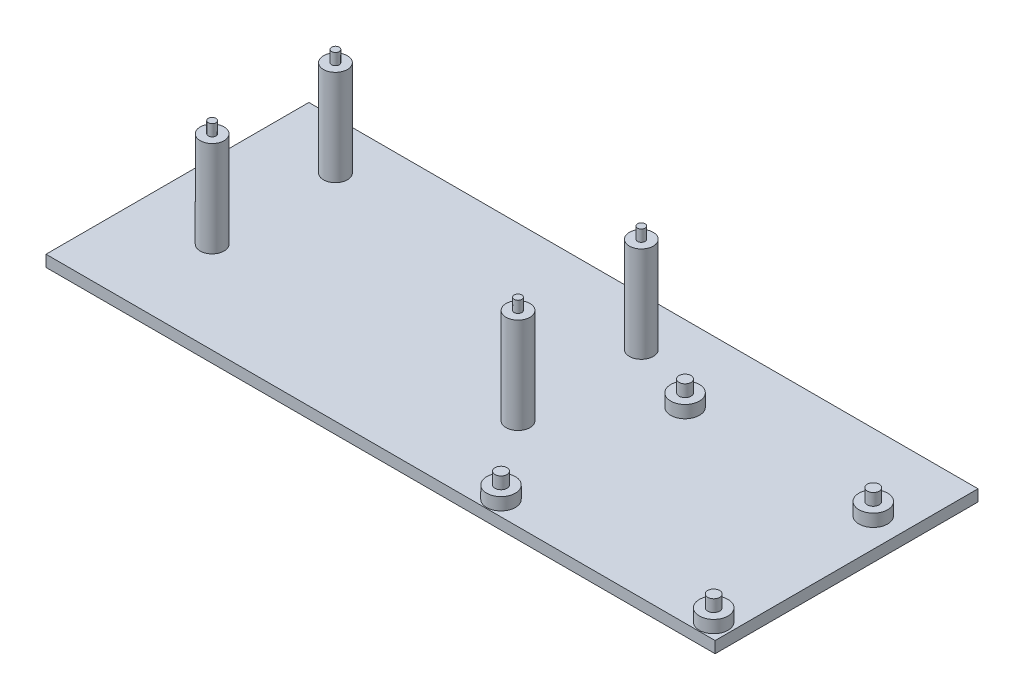
ISO-10303-21;
HEADER;
FILE_DESCRIPTION(('STEP AP214'),'2;1');
FILE_NAME('part.step','',(''),(''),'','','');
FILE_SCHEMA(('AUTOMOTIVE_DESIGN { 1 0 10303 214 1 1 1 1 }'));
ENDSEC;
DATA;
#1=APPLICATION_CONTEXT('core data for automotive mechanical design processes');
#2=APPLICATION_PROTOCOL_DEFINITION('international standard','automotive_design',2000,#1);
#3=PRODUCT_CONTEXT('',#1,'mechanical');
#4=PRODUCT('Part','Part','',(#3));
#5=PRODUCT_RELATED_PRODUCT_CATEGORY('part','',(#4));
#6=PRODUCT_DEFINITION_FORMATION('','',#4);
#7=PRODUCT_DEFINITION_CONTEXT('part definition',#1,'design');
#8=PRODUCT_DEFINITION('design','',#6,#7);
#9=PRODUCT_DEFINITION_SHAPE('','',#8);
#10=(LENGTH_UNIT() NAMED_UNIT(*) SI_UNIT(.MILLI.,.METRE.));
#11=(NAMED_UNIT(*) PLANE_ANGLE_UNIT() SI_UNIT($,.RADIAN.));
#12=(NAMED_UNIT(*) SI_UNIT($,.STERADIAN.) SOLID_ANGLE_UNIT());
#13=UNCERTAINTY_MEASURE_WITH_UNIT(LENGTH_MEASURE(1.E-05),#10,'distance_accuracy_value','');
#14=(GEOMETRIC_REPRESENTATION_CONTEXT(3) GLOBAL_UNCERTAINTY_ASSIGNED_CONTEXT((#13)) GLOBAL_UNIT_ASSIGNED_CONTEXT((#10,
#11,#12)) REPRESENTATION_CONTEXT('',''));
#15=CARTESIAN_POINT('',(0.,0.,0.));
#16=DIRECTION('',(0.,0.,1.));
#17=DIRECTION('',(1.,0.,0.));
#18=AXIS2_PLACEMENT_3D('',#15,#16,#17);
#19=CARTESIAN_POINT('',(-70.,2.4,27.5));
#20=DIRECTION('',(-1.,0.,0.));
#21=DIRECTION('',(0.,0.,1.));
#22=AXIS2_PLACEMENT_3D('',#19,#20,#21);
#23=PLANE('',#22);
#24=DIRECTION('',(0.,0.,-1.));
#25=VECTOR('',#24,1.);
#26=CARTESIAN_POINT('',(-70.,0.,27.5));
#27=LINE('',#26,#25);
#28=CARTESIAN_POINT('',(-70.,0.,27.5));
#29=VERTEX_POINT('',#28);
#30=CARTESIAN_POINT('',(-70.,0.,-27.5));
#31=VERTEX_POINT('',#30);
#32=EDGE_CURVE('E118',#29,#31,#27,.T.);
#33=ORIENTED_EDGE('',*,*,#32,.F.);
#34=DIRECTION('',(0.,-1.,0.));
#35=VECTOR('',#34,1.);
#36=CARTESIAN_POINT('',(-70.,2.4,27.5));
#37=LINE('',#36,#35);
#38=CARTESIAN_POINT('',(-70.,2.4,27.5));
#39=VERTEX_POINT('',#38);
#40=EDGE_CURVE('E65',#39,#29,#37,.T.);
#41=ORIENTED_EDGE('',*,*,#40,.F.);
#42=DIRECTION('',(0.,0.,-1.));
#43=VECTOR('',#42,1.);
#44=CARTESIAN_POINT('',(-70.,2.4,27.5));
#45=LINE('',#44,#43);
#46=CARTESIAN_POINT('',(-70.,2.4,-27.5));
#47=VERTEX_POINT('',#46);
#48=EDGE_CURVE('E112',#39,#47,#45,.T.);
#49=ORIENTED_EDGE('',*,*,#48,.T.);
#50=DIRECTION('',(0.,-1.,0.));
#51=VECTOR('',#50,1.);
#52=CARTESIAN_POINT('',(-70.,2.4,-27.5));
#53=LINE('',#52,#51);
#54=EDGE_CURVE('E90',#47,#31,#53,.T.);
#55=ORIENTED_EDGE('',*,*,#54,.T.);
#56=EDGE_LOOP('',(#33,#41,#49,#55));
#57=FACE_BOUND('',#56,.T.);
#58=ADVANCED_FACE('F47',(#57),#23,.T.);
#59=CARTESIAN_POINT('',(-70.,2.4,27.5));
#60=DIRECTION('',(0.,0.,-1.));
#61=DIRECTION('',(-1.,0.,0.));
#62=AXIS2_PLACEMENT_3D('',#59,#60,#61);
#63=PLANE('',#62);
#64=DIRECTION('',(1.,0.,0.));
#65=VECTOR('',#64,1.);
#66=CARTESIAN_POINT('',(-70.,0.,27.5));
#67=LINE('',#66,#65);
#68=CARTESIAN_POINT('',(70.,0.,27.5));
#69=VERTEX_POINT('',#68);
#70=EDGE_CURVE('E82',#29,#69,#67,.T.);
#71=ORIENTED_EDGE('',*,*,#70,.T.);
#72=DIRECTION('',(0.,-1.,0.));
#73=VECTOR('',#72,1.);
#74=CARTESIAN_POINT('',(70.,2.4,27.5));
#75=LINE('',#74,#73);
#76=CARTESIAN_POINT('',(70.,2.4,27.5));
#77=VERTEX_POINT('',#76);
#78=EDGE_CURVE('E109',#77,#69,#75,.T.);
#79=ORIENTED_EDGE('',*,*,#78,.F.);
#80=DIRECTION('',(1.,0.,0.));
#81=VECTOR('',#80,1.);
#82=CARTESIAN_POINT('',(-70.,2.4,27.5));
#83=LINE('',#82,#81);
#84=EDGE_CURVE('E100',#39,#77,#83,.T.);
#85=ORIENTED_EDGE('',*,*,#84,.F.);
#86=ORIENTED_EDGE('',*,*,#40,.T.);
#87=EDGE_LOOP('',(#71,#79,#85,#86));
#88=FACE_BOUND('',#87,.T.);
#89=ADVANCED_FACE('F231',(#88),#63,.F.);
#90=CARTESIAN_POINT('',(70.,2.4,27.5));
#91=DIRECTION('',(-1.,0.,0.));
#92=DIRECTION('',(0.,0.,1.));
#93=AXIS2_PLACEMENT_3D('',#90,#91,#92);
#94=PLANE('',#93);
#95=DIRECTION('',(0.,0.,-1.));
#96=VECTOR('',#95,1.);
#97=CARTESIAN_POINT('',(70.,0.,27.5));
#98=LINE('',#97,#96);
#99=CARTESIAN_POINT('',(70.,0.,-27.5));
#100=VERTEX_POINT('',#99);
#101=EDGE_CURVE('E107',#69,#100,#98,.T.);
#102=ORIENTED_EDGE('',*,*,#101,.T.);
#103=DIRECTION('',(0.,-1.,0.));
#104=VECTOR('',#103,1.);
#105=CARTESIAN_POINT('',(70.,2.4,-27.5));
#106=LINE('',#105,#104);
#107=CARTESIAN_POINT('',(70.,2.4,-27.5));
#108=VERTEX_POINT('',#107);
#109=EDGE_CURVE('E104',#108,#100,#106,.T.);
#110=ORIENTED_EDGE('',*,*,#109,.F.);
#111=DIRECTION('',(0.,0.,-1.));
#112=VECTOR('',#111,1.);
#113=CARTESIAN_POINT('',(70.,2.4,27.5));
#114=LINE('',#113,#112);
#115=EDGE_CURVE('E95',#77,#108,#114,.T.);
#116=ORIENTED_EDGE('',*,*,#115,.F.);
#117=ORIENTED_EDGE('',*,*,#78,.T.);
#118=EDGE_LOOP('',(#102,#110,#116,#117));
#119=FACE_BOUND('',#118,.T.);
#120=ADVANCED_FACE('F105',(#119),#94,.F.);
#121=CARTESIAN_POINT('',(-70.,2.4,-27.5));
#122=DIRECTION('',(0.,0.,-1.));
#123=DIRECTION('',(-1.,0.,0.));
#124=AXIS2_PLACEMENT_3D('',#121,#122,#123);
#125=PLANE('',#124);
#126=DIRECTION('',(1.,0.,0.));
#127=VECTOR('',#126,1.);
#128=CARTESIAN_POINT('',(-70.,0.,-27.5));
#129=LINE('',#128,#127);
#130=EDGE_CURVE('E121',#31,#100,#129,.T.);
#131=ORIENTED_EDGE('',*,*,#130,.F.);
#132=ORIENTED_EDGE('',*,*,#54,.F.);
#133=DIRECTION('',(1.,0.,0.));
#134=VECTOR('',#133,1.);
#135=CARTESIAN_POINT('',(-70.,2.4,-27.5));
#136=LINE('',#135,#134);
#137=EDGE_CURVE('E99',#47,#108,#136,.T.);
#138=ORIENTED_EDGE('',*,*,#137,.T.);
#139=ORIENTED_EDGE('',*,*,#109,.T.);
#140=EDGE_LOOP('',(#131,#132,#138,#139));
#141=FACE_BOUND('',#140,.T.);
#142=ADVANCED_FACE('F111',(#141),#125,.T.);
#143=CARTESIAN_POINT('',(0.,2.4,0.));
#144=DIRECTION('',(0.,-1.,0.));
#145=DIRECTION('',(0.,0.,-1.));
#146=AXIS2_PLACEMENT_3D('',#143,#144,#145);
#147=PLANE('',#146);
#148=CARTESIAN_POINT('',(9.56,2.4,8.29999999999999));
#149=DIRECTION('',(0.,-1.,0.));
#150=DIRECTION('',(0.,0.,-1.));
#151=AXIS2_PLACEMENT_3D('',#148,#149,#150);
#152=CIRCLE('',#151,2.5);
#153=CARTESIAN_POINT('',(9.56,2.4,5.79999999999999));
#154=VERTEX_POINT('',#153);
#155=EDGE_CURVE('E50',#154,#154,#152,.F.);
#156=ORIENTED_EDGE('',*,*,#155,.F.);
#157=EDGE_LOOP('',(#156));
#158=FACE_BOUND('',#157,.T.);
#159=CARTESIAN_POINT('',(-54.44,2.4,8.3));
#160=DIRECTION('',(0.,-1.,0.));
#161=DIRECTION('',(0.,0.,-1.));
#162=AXIS2_PLACEMENT_3D('',#159,#160,#161);
#163=CIRCLE('',#162,2.5);
#164=CARTESIAN_POINT('',(-54.44,2.4,5.8));
#165=VERTEX_POINT('',#164);
#166=EDGE_CURVE('E148',#165,#165,#163,.F.);
#167=ORIENTED_EDGE('',*,*,#166,.F.);
#168=EDGE_LOOP('',(#167));
#169=FACE_BOUND('',#168,.T.);
#170=CARTESIAN_POINT('',(-54.44,2.4,-17.5));
#171=DIRECTION('',(0.,-1.,0.));
#172=DIRECTION('',(0.,0.,-1.));
#173=AXIS2_PLACEMENT_3D('',#170,#171,#172);
#174=CIRCLE('',#173,2.5);
#175=CARTESIAN_POINT('',(-54.44,2.4,-20.));
#176=VERTEX_POINT('',#175);
#177=EDGE_CURVE('E145',#176,#176,#174,.F.);
#178=ORIENTED_EDGE('',*,*,#177,.F.);
#179=EDGE_LOOP('',(#178));
#180=FACE_BOUND('',#179,.T.);
#181=CARTESIAN_POINT('',(9.55999999999999,2.4,-17.5));
#182=DIRECTION('',(0.,-1.,0.));
#183=DIRECTION('',(0.,0.,-1.));
#184=AXIS2_PLACEMENT_3D('',#181,#182,#183);
#185=CIRCLE('',#184,2.5);
#186=CARTESIAN_POINT('',(9.55999999999999,2.4,-20.));
#187=VERTEX_POINT('',#186);
#188=EDGE_CURVE('E142',#187,#187,#185,.F.);
#189=ORIENTED_EDGE('',*,*,#188,.F.);
#190=EDGE_LOOP('',(#189));
#191=FACE_BOUND('',#190,.T.);
#192=CARTESIAN_POINT('',(24.56,2.4,-11.65));
#193=DIRECTION('',(0.,-1.,0.));
#194=DIRECTION('',(0.,0.,-1.));
#195=AXIS2_PLACEMENT_3D('',#192,#193,#194);
#196=CIRCLE('',#195,3.);
#197=CARTESIAN_POINT('',(24.56,2.4,-14.65));
#198=VERTEX_POINT('',#197);
#199=EDGE_CURVE('E138',#198,#198,#196,.F.);
#200=ORIENTED_EDGE('',*,*,#199,.F.);
#201=EDGE_LOOP('',(#200));
#202=FACE_BOUND('',#201,.T.);
#203=CARTESIAN_POINT('',(22.,2.4,24.3));
#204=DIRECTION('',(0.,-1.,0.));
#205=DIRECTION('',(0.,0.,-1.));
#206=AXIS2_PLACEMENT_3D('',#203,#204,#205);
#207=CIRCLE('',#206,3.);
#208=CARTESIAN_POINT('',(22.,2.4,21.3));
#209=VERTEX_POINT('',#208);
#210=EDGE_CURVE('E135',#209,#209,#207,.F.);
#211=ORIENTED_EDGE('',*,*,#210,.F.);
#212=EDGE_LOOP('',(#211));
#213=FACE_BOUND('',#212,.T.);
#214=CARTESIAN_POINT('',(63.94,2.4,-11.65));
#215=DIRECTION('',(0.,-1.,0.));
#216=DIRECTION('',(0.,0.,-1.));
#217=AXIS2_PLACEMENT_3D('',#214,#215,#216);
#218=CIRCLE('',#217,3.00000000000001);
#219=CARTESIAN_POINT('',(63.94,2.4,-14.65));
#220=VERTEX_POINT('',#219);
#221=EDGE_CURVE('E132',#220,#220,#218,.F.);
#222=ORIENTED_EDGE('',*,*,#221,.F.);
#223=EDGE_LOOP('',(#222));
#224=FACE_BOUND('',#223,.T.);
#225=CARTESIAN_POINT('',(66.5,2.4,24.3));
#226=DIRECTION('',(0.,-1.,0.));
#227=DIRECTION('',(0.,0.,-1.));
#228=AXIS2_PLACEMENT_3D('',#225,#226,#227);
#229=CIRCLE('',#228,3.00000000000001);
#230=CARTESIAN_POINT('',(66.5,2.4,21.3));
#231=VERTEX_POINT('',#230);
#232=EDGE_CURVE('E127',#231,#231,#229,.F.);
#233=ORIENTED_EDGE('',*,*,#232,.F.);
#234=EDGE_LOOP('',(#233));
#235=FACE_BOUND('',#234,.T.);
#236=ORIENTED_EDGE('',*,*,#48,.F.);
#237=ORIENTED_EDGE('',*,*,#84,.T.);
#238=ORIENTED_EDGE('',*,*,#115,.T.);
#239=ORIENTED_EDGE('',*,*,#137,.F.);
#240=EDGE_LOOP('',(#236,#237,#238,#239));
#241=FACE_BOUND('',#240,.T.);
#242=ADVANCED_FACE('F98',(#158,#169,#180,#191,#202,#213,#224,#235,#241),#147,.F.);
#243=CARTESIAN_POINT('',(0.,0.,0.));
#244=DIRECTION('',(0.,-1.,0.));
#245=DIRECTION('',(0.,0.,-1.));
#246=AXIS2_PLACEMENT_3D('',#243,#244,#245);
#247=PLANE('',#246);
#248=ORIENTED_EDGE('',*,*,#32,.T.);
#249=ORIENTED_EDGE('',*,*,#130,.T.);
#250=ORIENTED_EDGE('',*,*,#101,.F.);
#251=ORIENTED_EDGE('',*,*,#70,.F.);
#252=EDGE_LOOP('',(#248,#249,#250,#251));
#253=FACE_BOUND('',#252,.T.);
#254=ADVANCED_FACE('F216',(#253),#247,.T.);
#255=CARTESIAN_POINT('',(66.5,5.,24.3));
#256=DIRECTION('',(0.,-1.,0.));
#257=DIRECTION('',(0.,0.,-1.));
#258=AXIS2_PLACEMENT_3D('',#255,#256,#257);
#259=CYLINDRICAL_SURFACE('',#258,3.00000000000001);
#260=CARTESIAN_POINT('',(66.5,5.,24.3));
#261=DIRECTION('',(0.,1.,0.));
#262=DIRECTION('',(0.,0.,1.));
#263=AXIS2_PLACEMENT_3D('',#260,#261,#262);
#264=CIRCLE('',#263,3.00000000000001);
#265=CARTESIAN_POINT('',(66.5,5.,27.3));
#266=VERTEX_POINT('',#265);
#267=EDGE_CURVE('E122',#266,#266,#264,.T.);
#268=ORIENTED_EDGE('',*,*,#267,.F.);
#269=EDGE_LOOP('',(#268));
#270=FACE_BOUND('',#269,.T.);
#271=ORIENTED_EDGE('',*,*,#232,.T.);
#272=EDGE_LOOP('',(#271));
#273=FACE_BOUND('',#272,.T.);
#274=ADVANCED_FACE('F213',(#270,#273),#259,.T.);
#275=CARTESIAN_POINT('',(66.5,5.,24.3));
#276=DIRECTION('',(0.,1.,0.));
#277=DIRECTION('',(0.,0.,1.));
#278=AXIS2_PLACEMENT_3D('',#275,#276,#277);
#279=PLANE('',#278);
#280=CARTESIAN_POINT('',(66.5,5.,24.3));
#281=DIRECTION('',(0.,1.,0.));
#282=DIRECTION('',(0.,0.,1.));
#283=AXIS2_PLACEMENT_3D('',#280,#281,#282);
#284=CIRCLE('',#283,1.25);
#285=CARTESIAN_POINT('',(66.5,5.,25.55));
#286=VERTEX_POINT('',#285);
#287=EDGE_CURVE('E184',#286,#286,#284,.T.);
#288=ORIENTED_EDGE('',*,*,#287,.F.);
#289=EDGE_LOOP('',(#288));
#290=FACE_BOUND('',#289,.T.);
#291=ORIENTED_EDGE('',*,*,#267,.T.);
#292=EDGE_LOOP('',(#291));
#293=FACE_BOUND('',#292,.T.);
#294=ADVANCED_FACE('F211',(#290,#293),#279,.T.);
#295=CARTESIAN_POINT('',(63.94,5.,-11.65));
#296=DIRECTION('',(0.,-1.,0.));
#297=DIRECTION('',(0.,0.,-1.));
#298=AXIS2_PLACEMENT_3D('',#295,#296,#297);
#299=CYLINDRICAL_SURFACE('',#298,3.00000000000001);
#300=CARTESIAN_POINT('',(63.94,5.,-11.65));
#301=DIRECTION('',(0.,1.,0.));
#302=DIRECTION('',(0.,0.,1.));
#303=AXIS2_PLACEMENT_3D('',#300,#301,#302);
#304=CIRCLE('',#303,3.00000000000001);
#305=CARTESIAN_POINT('',(63.94,5.,-8.65));
#306=VERTEX_POINT('',#305);
#307=EDGE_CURVE('E206',#306,#306,#304,.T.);
#308=ORIENTED_EDGE('',*,*,#307,.F.);
#309=EDGE_LOOP('',(#308));
#310=FACE_BOUND('',#309,.T.);
#311=ORIENTED_EDGE('',*,*,#221,.T.);
#312=EDGE_LOOP('',(#311));
#313=FACE_BOUND('',#312,.T.);
#314=ADVANCED_FACE('F266',(#310,#313),#299,.T.);
#315=CARTESIAN_POINT('',(63.94,5.,-11.65));
#316=DIRECTION('',(0.,1.,0.));
#317=DIRECTION('',(0.,0.,1.));
#318=AXIS2_PLACEMENT_3D('',#315,#316,#317);
#319=PLANE('',#318);
#320=CARTESIAN_POINT('',(63.94,5.,-11.65));
#321=DIRECTION('',(0.,1.,0.));
#322=DIRECTION('',(0.,0.,1.));
#323=AXIS2_PLACEMENT_3D('',#320,#321,#322);
#324=CIRCLE('',#323,1.25);
#325=CARTESIAN_POINT('',(63.94,5.,-10.4));
#326=VERTEX_POINT('',#325);
#327=EDGE_CURVE('E146',#326,#326,#324,.T.);
#328=ORIENTED_EDGE('',*,*,#327,.F.);
#329=EDGE_LOOP('',(#328));
#330=FACE_BOUND('',#329,.T.);
#331=ORIENTED_EDGE('',*,*,#307,.T.);
#332=EDGE_LOOP('',(#331));
#333=FACE_BOUND('',#332,.T.);
#334=ADVANCED_FACE('F271',(#330,#333),#319,.T.);
#335=CARTESIAN_POINT('',(22.,5.,24.3));
#336=DIRECTION('',(0.,-1.,0.));
#337=DIRECTION('',(0.,0.,-1.));
#338=AXIS2_PLACEMENT_3D('',#335,#336,#337);
#339=CYLINDRICAL_SURFACE('',#338,3.);
#340=CARTESIAN_POINT('',(22.,5.,24.3));
#341=DIRECTION('',(0.,1.,0.));
#342=DIRECTION('',(0.,0.,1.));
#343=AXIS2_PLACEMENT_3D('',#340,#341,#342);
#344=CIRCLE('',#343,3.);
#345=CARTESIAN_POINT('',(22.,5.,27.3));
#346=VERTEX_POINT('',#345);
#347=EDGE_CURVE('E203',#346,#346,#344,.T.);
#348=ORIENTED_EDGE('',*,*,#347,.F.);
#349=EDGE_LOOP('',(#348));
#350=FACE_BOUND('',#349,.T.);
#351=ORIENTED_EDGE('',*,*,#210,.T.);
#352=EDGE_LOOP('',(#351));
#353=FACE_BOUND('',#352,.T.);
#354=ADVANCED_FACE('F279',(#350,#353),#339,.T.);
#355=CARTESIAN_POINT('',(22.,5.,24.3));
#356=DIRECTION('',(0.,1.,0.));
#357=DIRECTION('',(0.,0.,1.));
#358=AXIS2_PLACEMENT_3D('',#355,#356,#357);
#359=PLANE('',#358);
#360=CARTESIAN_POINT('',(22.,5.,24.3));
#361=DIRECTION('',(0.,1.,0.));
#362=DIRECTION('',(0.,0.,1.));
#363=AXIS2_PLACEMENT_3D('',#360,#361,#362);
#364=CIRCLE('',#363,1.25);
#365=CARTESIAN_POINT('',(22.,5.,25.55));
#366=VERTEX_POINT('',#365);
#367=EDGE_CURVE('E141',#366,#366,#364,.T.);
#368=ORIENTED_EDGE('',*,*,#367,.F.);
#369=EDGE_LOOP('',(#368));
#370=FACE_BOUND('',#369,.T.);
#371=ORIENTED_EDGE('',*,*,#347,.T.);
#372=EDGE_LOOP('',(#371));
#373=FACE_BOUND('',#372,.T.);
#374=ADVANCED_FACE('F284',(#370,#373),#359,.T.);
#375=CARTESIAN_POINT('',(24.56,5.,-11.65));
#376=DIRECTION('',(0.,-1.,0.));
#377=DIRECTION('',(0.,0.,-1.));
#378=AXIS2_PLACEMENT_3D('',#375,#376,#377);
#379=CYLINDRICAL_SURFACE('',#378,3.);
#380=CARTESIAN_POINT('',(24.56,5.,-11.65));
#381=DIRECTION('',(0.,1.,0.));
#382=DIRECTION('',(0.,0.,1.));
#383=AXIS2_PLACEMENT_3D('',#380,#381,#382);
#384=CIRCLE('',#383,3.);
#385=CARTESIAN_POINT('',(24.56,5.,-8.65000000000001));
#386=VERTEX_POINT('',#385);
#387=EDGE_CURVE('E198',#386,#386,#384,.T.);
#388=ORIENTED_EDGE('',*,*,#387,.F.);
#389=EDGE_LOOP('',(#388));
#390=FACE_BOUND('',#389,.T.);
#391=ORIENTED_EDGE('',*,*,#199,.T.);
#392=EDGE_LOOP('',(#391));
#393=FACE_BOUND('',#392,.T.);
#394=ADVANCED_FACE('F292',(#390,#393),#379,.T.);
#395=CARTESIAN_POINT('',(24.56,5.,-11.65));
#396=DIRECTION('',(0.,1.,0.));
#397=DIRECTION('',(0.,0.,1.));
#398=AXIS2_PLACEMENT_3D('',#395,#396,#397);
#399=PLANE('',#398);
#400=CARTESIAN_POINT('',(24.56,5.,-11.65));
#401=DIRECTION('',(0.,1.,0.));
#402=DIRECTION('',(0.,0.,1.));
#403=AXIS2_PLACEMENT_3D('',#400,#401,#402);
#404=CIRCLE('',#403,1.25);
#405=CARTESIAN_POINT('',(24.56,5.,-10.4));
#406=VERTEX_POINT('',#405);
#407=EDGE_CURVE('E190',#406,#406,#404,.T.);
#408=ORIENTED_EDGE('',*,*,#407,.F.);
#409=EDGE_LOOP('',(#408));
#410=FACE_BOUND('',#409,.T.);
#411=ORIENTED_EDGE('',*,*,#387,.T.);
#412=EDGE_LOOP('',(#411));
#413=FACE_BOUND('',#412,.T.);
#414=ADVANCED_FACE('F297',(#410,#413),#399,.T.);
#415=CARTESIAN_POINT('',(22.,7.5,24.3));
#416=DIRECTION('',(0.,-1.,0.));
#417=DIRECTION('',(0.,0.,-1.));
#418=AXIS2_PLACEMENT_3D('',#415,#416,#417);
#419=CYLINDRICAL_SURFACE('',#418,1.25);
#420=CARTESIAN_POINT('',(22.,7.5,24.3));
#421=DIRECTION('',(0.,1.,0.));
#422=DIRECTION('',(0.,0.,1.));
#423=AXIS2_PLACEMENT_3D('',#420,#421,#422);
#424=CIRCLE('',#423,1.25);
#425=CARTESIAN_POINT('',(22.,7.5,25.55));
#426=VERTEX_POINT('',#425);
#427=EDGE_CURVE('E193',#426,#426,#424,.T.);
#428=ORIENTED_EDGE('',*,*,#427,.F.);
#429=EDGE_LOOP('',(#428));
#430=FACE_BOUND('',#429,.T.);
#431=ORIENTED_EDGE('',*,*,#367,.T.);
#432=EDGE_LOOP('',(#431));
#433=FACE_BOUND('',#432,.T.);
#434=ADVANCED_FACE('F328',(#430,#433),#419,.T.);
#435=CARTESIAN_POINT('',(22.,7.5,24.3));
#436=DIRECTION('',(0.,1.,0.));
#437=DIRECTION('',(0.,0.,1.));
#438=AXIS2_PLACEMENT_3D('',#435,#436,#437);
#439=PLANE('',#438);
#440=ORIENTED_EDGE('',*,*,#427,.T.);
#441=EDGE_LOOP('',(#440));
#442=FACE_BOUND('',#441,.T.);
#443=ADVANCED_FACE('F338',(#442),#439,.T.);
#444=CARTESIAN_POINT('',(24.56,7.5,-11.65));
#445=DIRECTION('',(0.,-1.,0.));
#446=DIRECTION('',(0.,0.,-1.));
#447=AXIS2_PLACEMENT_3D('',#444,#445,#446);
#448=CYLINDRICAL_SURFACE('',#447,1.25);
#449=CARTESIAN_POINT('',(24.56,7.5,-11.65));
#450=DIRECTION('',(0.,1.,0.));
#451=DIRECTION('',(0.,0.,1.));
#452=AXIS2_PLACEMENT_3D('',#449,#450,#451);
#453=CIRCLE('',#452,1.25);
#454=CARTESIAN_POINT('',(24.56,7.5,-10.4));
#455=VERTEX_POINT('',#454);
#456=EDGE_CURVE('E187',#455,#455,#453,.T.);
#457=ORIENTED_EDGE('',*,*,#456,.F.);
#458=EDGE_LOOP('',(#457));
#459=FACE_BOUND('',#458,.T.);
#460=ORIENTED_EDGE('',*,*,#407,.T.);
#461=EDGE_LOOP('',(#460));
#462=FACE_BOUND('',#461,.T.);
#463=ADVANCED_FACE('F348',(#459,#462),#448,.T.);
#464=CARTESIAN_POINT('',(24.56,7.5,-11.65));
#465=DIRECTION('',(0.,1.,0.));
#466=DIRECTION('',(0.,0.,1.));
#467=AXIS2_PLACEMENT_3D('',#464,#465,#466);
#468=PLANE('',#467);
#469=ORIENTED_EDGE('',*,*,#456,.T.);
#470=EDGE_LOOP('',(#469));
#471=FACE_BOUND('',#470,.T.);
#472=ADVANCED_FACE('F358',(#471),#468,.T.);
#473=CARTESIAN_POINT('',(66.5,7.5,24.3));
#474=DIRECTION('',(0.,-1.,0.));
#475=DIRECTION('',(0.,0.,-1.));
#476=AXIS2_PLACEMENT_3D('',#473,#474,#475);
#477=CYLINDRICAL_SURFACE('',#476,1.25);
#478=CARTESIAN_POINT('',(66.5,7.5,24.3));
#479=DIRECTION('',(0.,1.,0.));
#480=DIRECTION('',(0.,0.,1.));
#481=AXIS2_PLACEMENT_3D('',#478,#479,#480);
#482=CIRCLE('',#481,1.25);
#483=CARTESIAN_POINT('',(66.5,7.5,25.55));
#484=VERTEX_POINT('',#483);
#485=EDGE_CURVE('E181',#484,#484,#482,.T.);
#486=ORIENTED_EDGE('',*,*,#485,.F.);
#487=EDGE_LOOP('',(#486));
#488=FACE_BOUND('',#487,.T.);
#489=ORIENTED_EDGE('',*,*,#287,.T.);
#490=EDGE_LOOP('',(#489));
#491=FACE_BOUND('',#490,.T.);
#492=ADVANCED_FACE('F368',(#488,#491),#477,.T.);
#493=CARTESIAN_POINT('',(66.5,7.5,24.3));
#494=DIRECTION('',(0.,1.,0.));
#495=DIRECTION('',(0.,0.,1.));
#496=AXIS2_PLACEMENT_3D('',#493,#494,#495);
#497=PLANE('',#496);
#498=ORIENTED_EDGE('',*,*,#485,.T.);
#499=EDGE_LOOP('',(#498));
#500=FACE_BOUND('',#499,.T.);
#501=ADVANCED_FACE('F378',(#500),#497,.T.);
#502=CARTESIAN_POINT('',(63.94,7.5,-11.65));
#503=DIRECTION('',(0.,-1.,0.));
#504=DIRECTION('',(0.,0.,-1.));
#505=AXIS2_PLACEMENT_3D('',#502,#503,#504);
#506=CYLINDRICAL_SURFACE('',#505,1.25);
#507=CARTESIAN_POINT('',(63.94,7.5,-11.65));
#508=DIRECTION('',(0.,1.,0.));
#509=DIRECTION('',(0.,0.,1.));
#510=AXIS2_PLACEMENT_3D('',#507,#508,#509);
#511=CIRCLE('',#510,1.25);
#512=CARTESIAN_POINT('',(63.94,7.5,-10.4));
#513=VERTEX_POINT('',#512);
#514=EDGE_CURVE('E178',#513,#513,#511,.T.);
#515=ORIENTED_EDGE('',*,*,#514,.F.);
#516=EDGE_LOOP('',(#515));
#517=FACE_BOUND('',#516,.T.);
#518=ORIENTED_EDGE('',*,*,#327,.T.);
#519=EDGE_LOOP('',(#518));
#520=FACE_BOUND('',#519,.T.);
#521=ADVANCED_FACE('F388',(#517,#520),#506,.T.);
#522=CARTESIAN_POINT('',(63.94,7.5,-11.65));
#523=DIRECTION('',(0.,1.,0.));
#524=DIRECTION('',(0.,0.,1.));
#525=AXIS2_PLACEMENT_3D('',#522,#523,#524);
#526=PLANE('',#525);
#527=ORIENTED_EDGE('',*,*,#514,.T.);
#528=EDGE_LOOP('',(#527));
#529=FACE_BOUND('',#528,.T.);
#530=ADVANCED_FACE('F398',(#529),#526,.T.);
#531=CARTESIAN_POINT('',(9.55999999999999,22.4,-17.5));
#532=DIRECTION('',(0.,-1.,0.));
#533=DIRECTION('',(0.,0.,-1.));
#534=AXIS2_PLACEMENT_3D('',#531,#532,#533);
#535=CYLINDRICAL_SURFACE('',#534,2.5);
#536=CARTESIAN_POINT('',(9.55999999999999,22.4,-17.5));
#537=DIRECTION('',(0.,1.,0.));
#538=DIRECTION('',(0.,0.,1.));
#539=AXIS2_PLACEMENT_3D('',#536,#537,#538);
#540=CIRCLE('',#539,2.5);
#541=CARTESIAN_POINT('',(9.55999999999999,22.4,-15.));
#542=VERTEX_POINT('',#541);
#543=EDGE_CURVE('E175',#542,#542,#540,.T.);
#544=ORIENTED_EDGE('',*,*,#543,.F.);
#545=EDGE_LOOP('',(#544));
#546=FACE_BOUND('',#545,.T.);
#547=ORIENTED_EDGE('',*,*,#188,.T.);
#548=EDGE_LOOP('',(#547));
#549=FACE_BOUND('',#548,.T.);
#550=ADVANCED_FACE('F407',(#546,#549),#535,.T.);
#551=CARTESIAN_POINT('',(9.55999999999999,22.4,-17.5));
#552=DIRECTION('',(0.,1.,0.));
#553=DIRECTION('',(0.,0.,1.));
#554=AXIS2_PLACEMENT_3D('',#551,#552,#553);
#555=PLANE('',#554);
#556=CARTESIAN_POINT('',(9.55999999999999,22.4,-17.5));
#557=DIRECTION('',(0.,1.,0.));
#558=DIRECTION('',(0.,0.,1.));
#559=AXIS2_PLACEMENT_3D('',#556,#557,#558);
#560=CIRCLE('',#559,0.8);
#561=CARTESIAN_POINT('',(9.55999999999999,22.4,-16.7));
#562=VERTEX_POINT('',#561);
#563=EDGE_CURVE('E157',#562,#562,#560,.T.);
#564=ORIENTED_EDGE('',*,*,#563,.F.);
#565=EDGE_LOOP('',(#564));
#566=FACE_BOUND('',#565,.T.);
#567=ORIENTED_EDGE('',*,*,#543,.T.);
#568=EDGE_LOOP('',(#567));
#569=FACE_BOUND('',#568,.T.);
#570=ADVANCED_FACE('F421',(#566,#569),#555,.T.);
#571=CARTESIAN_POINT('',(-54.44,22.4,-17.5));
#572=DIRECTION('',(0.,-1.,0.));
#573=DIRECTION('',(0.,0.,-1.));
#574=AXIS2_PLACEMENT_3D('',#571,#572,#573);
#575=CYLINDRICAL_SURFACE('',#574,2.5);
#576=CARTESIAN_POINT('',(-54.44,22.4,-17.5));
#577=DIRECTION('',(0.,1.,0.));
#578=DIRECTION('',(0.,0.,1.));
#579=AXIS2_PLACEMENT_3D('',#576,#577,#578);
#580=CIRCLE('',#579,2.5);
#581=CARTESIAN_POINT('',(-54.44,22.4,-15.));
#582=VERTEX_POINT('',#581);
#583=EDGE_CURVE('E172',#582,#582,#580,.T.);
#584=ORIENTED_EDGE('',*,*,#583,.F.);
#585=EDGE_LOOP('',(#584));
#586=FACE_BOUND('',#585,.T.);
#587=ORIENTED_EDGE('',*,*,#177,.T.);
#588=EDGE_LOOP('',(#587));
#589=FACE_BOUND('',#588,.T.);
#590=ADVANCED_FACE('F429',(#586,#589),#575,.T.);
#591=CARTESIAN_POINT('',(-54.44,22.4,-17.5));
#592=DIRECTION('',(0.,1.,0.));
#593=DIRECTION('',(0.,0.,1.));
#594=AXIS2_PLACEMENT_3D('',#591,#592,#593);
#595=PLANE('',#594);
#596=CARTESIAN_POINT('',(-54.44,22.4,-17.5));
#597=DIRECTION('',(0.,1.,0.));
#598=DIRECTION('',(0.,0.,1.));
#599=AXIS2_PLACEMENT_3D('',#596,#597,#598);
#600=CIRCLE('',#599,0.800000000000003);
#601=CARTESIAN_POINT('',(-54.44,22.4,-16.7));
#602=VERTEX_POINT('',#601);
#603=EDGE_CURVE('E56',#602,#602,#600,.T.);
#604=ORIENTED_EDGE('',*,*,#603,.F.);
#605=EDGE_LOOP('',(#604));
#606=FACE_BOUND('',#605,.T.);
#607=ORIENTED_EDGE('',*,*,#583,.T.);
#608=EDGE_LOOP('',(#607));
#609=FACE_BOUND('',#608,.T.);
#610=ADVANCED_FACE('F434',(#606,#609),#595,.T.);
#611=CARTESIAN_POINT('',(-54.44,22.4,8.3));
#612=DIRECTION('',(0.,-1.,0.));
#613=DIRECTION('',(0.,0.,-1.));
#614=AXIS2_PLACEMENT_3D('',#611,#612,#613);
#615=CYLINDRICAL_SURFACE('',#614,2.5);
#616=CARTESIAN_POINT('',(-54.44,22.4,8.3));
#617=DIRECTION('',(0.,1.,0.));
#618=DIRECTION('',(0.,0.,1.));
#619=AXIS2_PLACEMENT_3D('',#616,#617,#618);
#620=CIRCLE('',#619,2.5);
#621=CARTESIAN_POINT('',(-54.44,22.4,10.8));
#622=VERTEX_POINT('',#621);
#623=EDGE_CURVE('E169',#622,#622,#620,.T.);
#624=ORIENTED_EDGE('',*,*,#623,.F.);
#625=EDGE_LOOP('',(#624));
#626=FACE_BOUND('',#625,.T.);
#627=ORIENTED_EDGE('',*,*,#166,.T.);
#628=EDGE_LOOP('',(#627));
#629=FACE_BOUND('',#628,.T.);
#630=ADVANCED_FACE('F442',(#626,#629),#615,.T.);
#631=CARTESIAN_POINT('',(-54.44,22.4,8.3));
#632=DIRECTION('',(0.,1.,0.));
#633=DIRECTION('',(0.,0.,1.));
#634=AXIS2_PLACEMENT_3D('',#631,#632,#633);
#635=PLANE('',#634);
#636=CARTESIAN_POINT('',(-54.44,22.4,8.3));
#637=DIRECTION('',(0.,1.,0.));
#638=DIRECTION('',(0.,0.,1.));
#639=AXIS2_PLACEMENT_3D('',#636,#637,#638);
#640=CIRCLE('',#639,0.800000000000002);
#641=CARTESIAN_POINT('',(-54.44,22.4,9.1));
#642=VERTEX_POINT('',#641);
#643=EDGE_CURVE('E13',#642,#642,#640,.T.);
#644=ORIENTED_EDGE('',*,*,#643,.F.);
#645=EDGE_LOOP('',(#644));
#646=FACE_BOUND('',#645,.T.);
#647=ORIENTED_EDGE('',*,*,#623,.T.);
#648=EDGE_LOOP('',(#647));
#649=FACE_BOUND('',#648,.T.);
#650=ADVANCED_FACE('F447',(#646,#649),#635,.T.);
#651=CARTESIAN_POINT('',(9.56,22.4,8.29999999999999));
#652=DIRECTION('',(0.,-1.,0.));
#653=DIRECTION('',(0.,0.,-1.));
#654=AXIS2_PLACEMENT_3D('',#651,#652,#653);
#655=CYLINDRICAL_SURFACE('',#654,2.5);
#656=CARTESIAN_POINT('',(9.56,22.4,8.29999999999999));
#657=DIRECTION('',(0.,1.,0.));
#658=DIRECTION('',(0.,0.,1.));
#659=AXIS2_PLACEMENT_3D('',#656,#657,#658);
#660=CIRCLE('',#659,2.5);
#661=CARTESIAN_POINT('',(9.56,22.4,10.8));
#662=VERTEX_POINT('',#661);
#663=EDGE_CURVE('E166',#662,#662,#660,.T.);
#664=ORIENTED_EDGE('',*,*,#663,.F.);
#665=EDGE_LOOP('',(#664));
#666=FACE_BOUND('',#665,.T.);
#667=ORIENTED_EDGE('',*,*,#155,.T.);
#668=EDGE_LOOP('',(#667));
#669=FACE_BOUND('',#668,.T.);
#670=ADVANCED_FACE('F455',(#666,#669),#655,.T.);
#671=CARTESIAN_POINT('',(9.56,22.4,8.29999999999999));
#672=DIRECTION('',(0.,1.,0.));
#673=DIRECTION('',(0.,0.,1.));
#674=AXIS2_PLACEMENT_3D('',#671,#672,#673);
#675=PLANE('',#674);
#676=CARTESIAN_POINT('',(9.56,22.4,8.29999999999999));
#677=DIRECTION('',(0.,1.,0.));
#678=DIRECTION('',(0.,0.,1.));
#679=AXIS2_PLACEMENT_3D('',#676,#677,#678);
#680=CIRCLE('',#679,0.800000000000001);
#681=CARTESIAN_POINT('',(9.56,22.4,9.09999999999999));
#682=VERTEX_POINT('',#681);
#683=EDGE_CURVE('E153',#682,#682,#680,.T.);
#684=ORIENTED_EDGE('',*,*,#683,.F.);
#685=EDGE_LOOP('',(#684));
#686=FACE_BOUND('',#685,.T.);
#687=ORIENTED_EDGE('',*,*,#663,.T.);
#688=EDGE_LOOP('',(#687));
#689=FACE_BOUND('',#688,.T.);
#690=ADVANCED_FACE('F460',(#686,#689),#675,.T.);
#691=CARTESIAN_POINT('',(9.56,24.8,8.29999999999999));
#692=DIRECTION('',(0.,-1.,0.));
#693=DIRECTION('',(0.,0.,-1.));
#694=AXIS2_PLACEMENT_3D('',#691,#692,#693);
#695=CYLINDRICAL_SURFACE('',#694,0.800000000000001);
#696=CARTESIAN_POINT('',(9.56,24.8,8.29999999999999));
#697=DIRECTION('',(0.,1.,0.));
#698=DIRECTION('',(0.,0.,1.));
#699=AXIS2_PLACEMENT_3D('',#696,#697,#698);
#700=CIRCLE('',#699,0.800000000000001);
#701=CARTESIAN_POINT('',(9.56,24.8,9.09999999999999));
#702=VERTEX_POINT('',#701);
#703=EDGE_CURVE('E165',#702,#702,#700,.T.);
#704=ORIENTED_EDGE('',*,*,#703,.F.);
#705=EDGE_LOOP('',(#704));
#706=FACE_BOUND('',#705,.T.);
#707=ORIENTED_EDGE('',*,*,#683,.T.);
#708=EDGE_LOOP('',(#707));
#709=FACE_BOUND('',#708,.T.);
#710=ADVANCED_FACE('F491',(#706,#709),#695,.T.);
#711=CARTESIAN_POINT('',(9.56,24.8,8.29999999999999));
#712=DIRECTION('',(0.,1.,0.));
#713=DIRECTION('',(0.,0.,1.));
#714=AXIS2_PLACEMENT_3D('',#711,#712,#713);
#715=PLANE('',#714);
#716=ORIENTED_EDGE('',*,*,#703,.T.);
#717=EDGE_LOOP('',(#716));
#718=FACE_BOUND('',#717,.T.);
#719=ADVANCED_FACE('F501',(#718),#715,.T.);
#720=CARTESIAN_POINT('',(9.55999999999999,24.8,-17.5));
#721=DIRECTION('',(0.,-1.,0.));
#722=DIRECTION('',(0.,0.,-1.));
#723=AXIS2_PLACEMENT_3D('',#720,#721,#722);
#724=CYLINDRICAL_SURFACE('',#723,0.8);
#725=CARTESIAN_POINT('',(9.55999999999999,24.8,-17.5));
#726=DIRECTION('',(0.,1.,0.));
#727=DIRECTION('',(0.,0.,1.));
#728=AXIS2_PLACEMENT_3D('',#725,#726,#727);
#729=CIRCLE('',#728,0.8);
#730=CARTESIAN_POINT('',(9.55999999999999,24.8,-16.7));
#731=VERTEX_POINT('',#730);
#732=EDGE_CURVE('E581',#731,#731,#729,.T.);
#733=ORIENTED_EDGE('',*,*,#732,.F.);
#734=EDGE_LOOP('',(#733));
#735=FACE_BOUND('',#734,.T.);
#736=ORIENTED_EDGE('',*,*,#563,.T.);
#737=EDGE_LOOP('',(#736));
#738=FACE_BOUND('',#737,.T.);
#739=ADVANCED_FACE('F511',(#735,#738),#724,.T.);
#740=CARTESIAN_POINT('',(9.55999999999999,24.8,-17.5));
#741=DIRECTION('',(0.,1.,0.));
#742=DIRECTION('',(0.,0.,1.));
#743=AXIS2_PLACEMENT_3D('',#740,#741,#742);
#744=PLANE('',#743);
#745=ORIENTED_EDGE('',*,*,#732,.T.);
#746=EDGE_LOOP('',(#745));
#747=FACE_BOUND('',#746,.T.);
#748=ADVANCED_FACE('F521',(#747),#744,.T.);
#749=CARTESIAN_POINT('',(-54.44,24.8,-17.5));
#750=DIRECTION('',(0.,-1.,0.));
#751=DIRECTION('',(0.,0.,-1.));
#752=AXIS2_PLACEMENT_3D('',#749,#750,#751);
#753=CYLINDRICAL_SURFACE('',#752,0.800000000000003);
#754=CARTESIAN_POINT('',(-54.44,24.8,-17.5));
#755=DIRECTION('',(0.,1.,0.));
#756=DIRECTION('',(0.,0.,1.));
#757=AXIS2_PLACEMENT_3D('',#754,#755,#756);
#758=CIRCLE('',#757,0.800000000000003);
#759=CARTESIAN_POINT('',(-54.44,24.8,-16.7));
#760=VERTEX_POINT('',#759);
#761=EDGE_CURVE('E578',#760,#760,#758,.T.);
#762=ORIENTED_EDGE('',*,*,#761,.F.);
#763=EDGE_LOOP('',(#762));
#764=FACE_BOUND('',#763,.T.);
#765=ORIENTED_EDGE('',*,*,#603,.T.);
#766=EDGE_LOOP('',(#765));
#767=FACE_BOUND('',#766,.T.);
#768=ADVANCED_FACE('F531',(#764,#767),#753,.T.);
#769=CARTESIAN_POINT('',(-54.44,24.8,-17.5));
#770=DIRECTION('',(0.,1.,0.));
#771=DIRECTION('',(0.,0.,1.));
#772=AXIS2_PLACEMENT_3D('',#769,#770,#771);
#773=PLANE('',#772);
#774=ORIENTED_EDGE('',*,*,#761,.T.);
#775=EDGE_LOOP('',(#774));
#776=FACE_BOUND('',#775,.T.);
#777=ADVANCED_FACE('F541',(#776),#773,.T.);
#778=CARTESIAN_POINT('',(-54.44,24.8,8.3));
#779=DIRECTION('',(0.,-1.,0.));
#780=DIRECTION('',(0.,0.,-1.));
#781=AXIS2_PLACEMENT_3D('',#778,#779,#780);
#782=CYLINDRICAL_SURFACE('',#781,0.800000000000002);
#783=CARTESIAN_POINT('',(-54.44,24.8,8.3));
#784=DIRECTION('',(0.,1.,0.));
#785=DIRECTION('',(0.,0.,1.));
#786=AXIS2_PLACEMENT_3D('',#783,#784,#785);
#787=CIRCLE('',#786,0.800000000000002);
#788=CARTESIAN_POINT('',(-54.44,24.8,9.1));
#789=VERTEX_POINT('',#788);
#790=EDGE_CURVE('E577',#789,#789,#787,.T.);
#791=ORIENTED_EDGE('',*,*,#790,.F.);
#792=EDGE_LOOP('',(#791));
#793=FACE_BOUND('',#792,.T.);
#794=ORIENTED_EDGE('',*,*,#643,.T.);
#795=EDGE_LOOP('',(#794));
#796=FACE_BOUND('',#795,.T.);
#797=ADVANCED_FACE('F551',(#793,#796),#782,.T.);
#798=CARTESIAN_POINT('',(-54.44,24.8,8.3));
#799=DIRECTION('',(0.,1.,0.));
#800=DIRECTION('',(0.,0.,1.));
#801=AXIS2_PLACEMENT_3D('',#798,#799,#800);
#802=PLANE('',#801);
#803=ORIENTED_EDGE('',*,*,#790,.T.);
#804=EDGE_LOOP('',(#803));
#805=FACE_BOUND('',#804,.T.);
#806=ADVANCED_FACE('F561',(#805),#802,.T.);
#807=CLOSED_SHELL('',(#58,#89,#120,#142,#242,#254,#274,#294,#314,#334,#354,#374,#394,#414,#434,
#443,#463,#472,#492,#501,#521,#530,#550,#570,#590,#610,#630,#650,#670,#690,#710,#719,#739,#748,
#768,#777,#797,#806));
#808=MANIFOLD_SOLID_BREP('B2',#807);
#809=ADVANCED_BREP_SHAPE_REPRESENTATION('',(#18,#808),#14);
#810=SHAPE_DEFINITION_REPRESENTATION(#9,#809);
ENDSEC;
END-ISO-10303-21;
